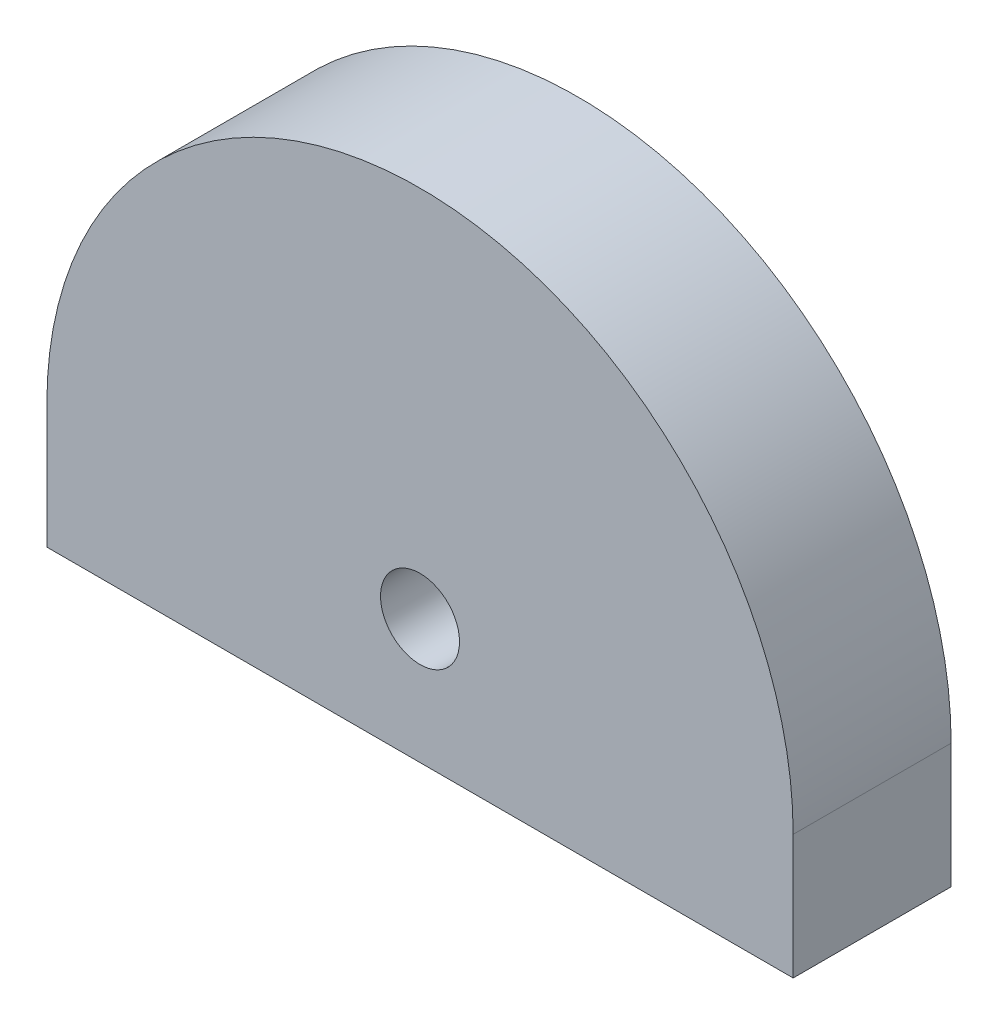
ISO-10303-21;
HEADER;
FILE_DESCRIPTION(('STEP AP214'),'2;1');
FILE_NAME('part.step','',(''),(''),'','','');
FILE_SCHEMA(('AUTOMOTIVE_DESIGN { 1 0 10303 214 1 1 1 1 }'));
ENDSEC;
DATA;
#1=APPLICATION_CONTEXT('core data for automotive mechanical design processes');
#2=APPLICATION_PROTOCOL_DEFINITION('international standard','automotive_design',2000,#1);
#3=PRODUCT_CONTEXT('',#1,'mechanical');
#4=PRODUCT('Part','Part','',(#3));
#5=PRODUCT_RELATED_PRODUCT_CATEGORY('part','',(#4));
#6=PRODUCT_DEFINITION_FORMATION('','',#4);
#7=PRODUCT_DEFINITION_CONTEXT('part definition',#1,'design');
#8=PRODUCT_DEFINITION('design','',#6,#7);
#9=PRODUCT_DEFINITION_SHAPE('','',#8);
#10=(LENGTH_UNIT() NAMED_UNIT(*) SI_UNIT(.MILLI.,.METRE.));
#11=(NAMED_UNIT(*) PLANE_ANGLE_UNIT() SI_UNIT($,.RADIAN.));
#12=(NAMED_UNIT(*) SI_UNIT($,.STERADIAN.) SOLID_ANGLE_UNIT());
#13=UNCERTAINTY_MEASURE_WITH_UNIT(LENGTH_MEASURE(1.E-05),#10,'distance_accuracy_value','');
#14=(GEOMETRIC_REPRESENTATION_CONTEXT(3) GLOBAL_UNCERTAINTY_ASSIGNED_CONTEXT((#13)) GLOBAL_UNIT_ASSIGNED_CONTEXT((#10,
#11,#12)) REPRESENTATION_CONTEXT('',''));
#15=CARTESIAN_POINT('',(0.,0.,0.));
#16=DIRECTION('',(0.,0.,1.));
#17=DIRECTION('',(1.,0.,0.));
#18=AXIS2_PLACEMENT_3D('',#15,#16,#17);
#19=CARTESIAN_POINT('',(0.,10.,6.35));
#20=DIRECTION('',(0.,0.,1.));
#21=DIRECTION('',(1.,0.,0.));
#22=AXIS2_PLACEMENT_3D('',#19,#20,#21);
#23=PLANE('',#22);
#24=CARTESIAN_POINT('',(0.,10.,6.35));
#25=DIRECTION('',(0.,0.,1.));
#26=DIRECTION('',(1.,0.,0.));
#27=AXIS2_PLACEMENT_3D('',#24,#25,#26);
#28=CIRCLE('',#27,30.);
#29=CARTESIAN_POINT('',(30.,10.,6.35));
#30=VERTEX_POINT('',#29);
#31=CARTESIAN_POINT('',(-30.,10.,6.35));
#32=VERTEX_POINT('',#31);
#33=EDGE_CURVE('E85',#30,#32,#28,.T.);
#34=ORIENTED_EDGE('',*,*,#33,.T.);
#35=DIRECTION('',(0.,-1.,0.));
#36=VECTOR('',#35,1.);
#37=CARTESIAN_POINT('',(-30.,10.,6.35));
#38=LINE('',#37,#36);
#39=CARTESIAN_POINT('',(-30.,0.,6.35));
#40=VERTEX_POINT('',#39);
#41=EDGE_CURVE('E80',#32,#40,#38,.T.);
#42=ORIENTED_EDGE('',*,*,#41,.T.);
#43=DIRECTION('',(1.,0.,0.));
#44=VECTOR('',#43,1.);
#45=CARTESIAN_POINT('',(-30.,0.,6.35));
#46=LINE('',#45,#44);
#47=CARTESIAN_POINT('',(30.,0.,6.35));
#48=VERTEX_POINT('',#47);
#49=EDGE_CURVE('E83',#40,#48,#46,.T.);
#50=ORIENTED_EDGE('',*,*,#49,.T.);
#51=DIRECTION('',(0.,1.,0.));
#52=VECTOR('',#51,1.);
#53=CARTESIAN_POINT('',(30.,10.,6.35));
#54=LINE('',#53,#52);
#55=EDGE_CURVE('E50',#48,#30,#54,.T.);
#56=ORIENTED_EDGE('',*,*,#55,.T.);
#57=EDGE_LOOP('',(#34,#42,#50,#56));
#58=FACE_BOUND('',#57,.T.);
#59=CARTESIAN_POINT('',(0.,10.,6.35));
#60=DIRECTION('',(0.,0.,1.));
#61=DIRECTION('',(1.,0.,0.));
#62=AXIS2_PLACEMENT_3D('',#59,#60,#61);
#63=CIRCLE('',#62,3.175);
#64=CARTESIAN_POINT('',(3.175,10.,6.35));
#65=VERTEX_POINT('',#64);
#66=EDGE_CURVE('E100',#65,#65,#63,.T.);
#67=ORIENTED_EDGE('',*,*,#66,.F.);
#68=EDGE_LOOP('',(#67));
#69=FACE_BOUND('',#68,.T.);
#70=ADVANCED_FACE('F33',(#58,#69),#23,.T.);
#71=CARTESIAN_POINT('',(0.,10.,-6.35));
#72=DIRECTION('',(0.,0.,1.));
#73=DIRECTION('',(1.,0.,0.));
#74=AXIS2_PLACEMENT_3D('',#71,#72,#73);
#75=PLANE('',#74);
#76=CARTESIAN_POINT('',(0.,10.,-6.35));
#77=DIRECTION('',(0.,0.,1.));
#78=DIRECTION('',(1.,0.,0.));
#79=AXIS2_PLACEMENT_3D('',#76,#77,#78);
#80=CIRCLE('',#79,30.);
#81=CARTESIAN_POINT('',(30.,10.,-6.35));
#82=VERTEX_POINT('',#81);
#83=CARTESIAN_POINT('',(-30.,10.,-6.35));
#84=VERTEX_POINT('',#83);
#85=EDGE_CURVE('E97',#82,#84,#80,.T.);
#86=ORIENTED_EDGE('',*,*,#85,.F.);
#87=DIRECTION('',(0.,1.,0.));
#88=VECTOR('',#87,1.);
#89=CARTESIAN_POINT('',(30.,10.,-6.35));
#90=LINE('',#89,#88);
#91=CARTESIAN_POINT('',(30.,0.,-6.35));
#92=VERTEX_POINT('',#91);
#93=EDGE_CURVE('E73',#92,#82,#90,.T.);
#94=ORIENTED_EDGE('',*,*,#93,.F.);
#95=DIRECTION('',(1.,0.,0.));
#96=VECTOR('',#95,1.);
#97=CARTESIAN_POINT('',(-30.,0.,-6.35));
#98=LINE('',#97,#96);
#99=CARTESIAN_POINT('',(-30.,0.,-6.35));
#100=VERTEX_POINT('',#99);
#101=EDGE_CURVE('E67',#100,#92,#98,.T.);
#102=ORIENTED_EDGE('',*,*,#101,.F.);
#103=DIRECTION('',(0.,-1.,0.));
#104=VECTOR('',#103,1.);
#105=CARTESIAN_POINT('',(-30.,10.,-6.35));
#106=LINE('',#105,#104);
#107=EDGE_CURVE('E89',#84,#100,#106,.T.);
#108=ORIENTED_EDGE('',*,*,#107,.F.);
#109=EDGE_LOOP('',(#86,#94,#102,#108));
#110=FACE_BOUND('',#109,.T.);
#111=CARTESIAN_POINT('',(0.,10.,-6.35));
#112=DIRECTION('',(0.,0.,1.));
#113=DIRECTION('',(1.,0.,0.));
#114=AXIS2_PLACEMENT_3D('',#111,#112,#113);
#115=CIRCLE('',#114,3.175);
#116=CARTESIAN_POINT('',(3.175,10.,-6.35));
#117=VERTEX_POINT('',#116);
#118=EDGE_CURVE('E112',#117,#117,#115,.T.);
#119=ORIENTED_EDGE('',*,*,#118,.T.);
#120=EDGE_LOOP('',(#119));
#121=FACE_BOUND('',#120,.T.);
#122=ADVANCED_FACE('F108',(#110,#121),#75,.F.);
#123=CARTESIAN_POINT('',(0.,10.,6.35));
#124=DIRECTION('',(0.,0.,-1.));
#125=DIRECTION('',(-1.,0.,0.));
#126=AXIS2_PLACEMENT_3D('',#123,#124,#125);
#127=CYLINDRICAL_SURFACE('',#126,30.);
#128=ORIENTED_EDGE('',*,*,#85,.T.);
#129=DIRECTION('',(0.,0.,-1.));
#130=VECTOR('',#129,1.);
#131=CARTESIAN_POINT('',(-30.,10.,6.35));
#132=LINE('',#131,#130);
#133=EDGE_CURVE('E11',#32,#84,#132,.T.);
#134=ORIENTED_EDGE('',*,*,#133,.F.);
#135=ORIENTED_EDGE('',*,*,#33,.F.);
#136=DIRECTION('',(0.,0.,-1.));
#137=VECTOR('',#136,1.);
#138=CARTESIAN_POINT('',(30.,10.,6.35));
#139=LINE('',#138,#137);
#140=EDGE_CURVE('E93',#30,#82,#139,.T.);
#141=ORIENTED_EDGE('',*,*,#140,.T.);
#142=EDGE_LOOP('',(#128,#134,#135,#141));
#143=FACE_BOUND('',#142,.T.);
#144=ADVANCED_FACE('F35',(#143),#127,.T.);
#145=CARTESIAN_POINT('',(-30.,10.,6.35));
#146=DIRECTION('',(1.,0.,0.));
#147=DIRECTION('',(0.,1.,0.));
#148=AXIS2_PLACEMENT_3D('',#145,#146,#147);
#149=PLANE('',#148);
#150=ORIENTED_EDGE('',*,*,#107,.T.);
#151=DIRECTION('',(0.,0.,-1.));
#152=VECTOR('',#151,1.);
#153=CARTESIAN_POINT('',(-30.,0.,6.35));
#154=LINE('',#153,#152);
#155=EDGE_CURVE('E42',#40,#100,#154,.T.);
#156=ORIENTED_EDGE('',*,*,#155,.F.);
#157=ORIENTED_EDGE('',*,*,#41,.F.);
#158=ORIENTED_EDGE('',*,*,#133,.T.);
#159=EDGE_LOOP('',(#150,#156,#157,#158));
#160=FACE_BOUND('',#159,.T.);
#161=ADVANCED_FACE('F88',(#160),#149,.F.);
#162=CARTESIAN_POINT('',(-30.,0.,6.35));
#163=DIRECTION('',(0.,1.,0.));
#164=DIRECTION('',(-1.,0.,0.));
#165=AXIS2_PLACEMENT_3D('',#162,#163,#164);
#166=PLANE('',#165);
#167=ORIENTED_EDGE('',*,*,#101,.T.);
#168=DIRECTION('',(0.,0.,-1.));
#169=VECTOR('',#168,1.);
#170=CARTESIAN_POINT('',(30.,0.,6.35));
#171=LINE('',#170,#169);
#172=EDGE_CURVE('E90',#48,#92,#171,.T.);
#173=ORIENTED_EDGE('',*,*,#172,.F.);
#174=ORIENTED_EDGE('',*,*,#49,.F.);
#175=ORIENTED_EDGE('',*,*,#155,.T.);
#176=EDGE_LOOP('',(#167,#173,#174,#175));
#177=FACE_BOUND('',#176,.T.);
#178=ADVANCED_FACE('F91',(#177),#166,.F.);
#179=CARTESIAN_POINT('',(30.,10.,6.35));
#180=DIRECTION('',(-1.,0.,0.));
#181=DIRECTION('',(0.,0.,1.));
#182=AXIS2_PLACEMENT_3D('',#179,#180,#181);
#183=PLANE('',#182);
#184=ORIENTED_EDGE('',*,*,#93,.T.);
#185=ORIENTED_EDGE('',*,*,#140,.F.);
#186=ORIENTED_EDGE('',*,*,#55,.F.);
#187=ORIENTED_EDGE('',*,*,#172,.T.);
#188=EDGE_LOOP('',(#184,#185,#186,#187));
#189=FACE_BOUND('',#188,.T.);
#190=ADVANCED_FACE('F105',(#189),#183,.F.);
#191=CARTESIAN_POINT('',(0.,10.,6.35));
#192=DIRECTION('',(0.,0.,-1.));
#193=DIRECTION('',(-1.,0.,0.));
#194=AXIS2_PLACEMENT_3D('',#191,#192,#193);
#195=CYLINDRICAL_SURFACE('',#194,3.175);
#196=ORIENTED_EDGE('',*,*,#66,.T.);
#197=EDGE_LOOP('',(#196));
#198=FACE_BOUND('',#197,.T.);
#199=ORIENTED_EDGE('',*,*,#118,.F.);
#200=EDGE_LOOP('',(#199));
#201=FACE_BOUND('',#200,.T.);
#202=ADVANCED_FACE('F118',(#198,#201),#195,.F.);
#203=CLOSED_SHELL('',(#70,#122,#144,#161,#178,#190,#202));
#204=MANIFOLD_SOLID_BREP('B2',#203);
#205=ADVANCED_BREP_SHAPE_REPRESENTATION('',(#18,#204),#14);
#206=SHAPE_DEFINITION_REPRESENTATION(#9,#205);
ENDSEC;
END-ISO-10303-21;
